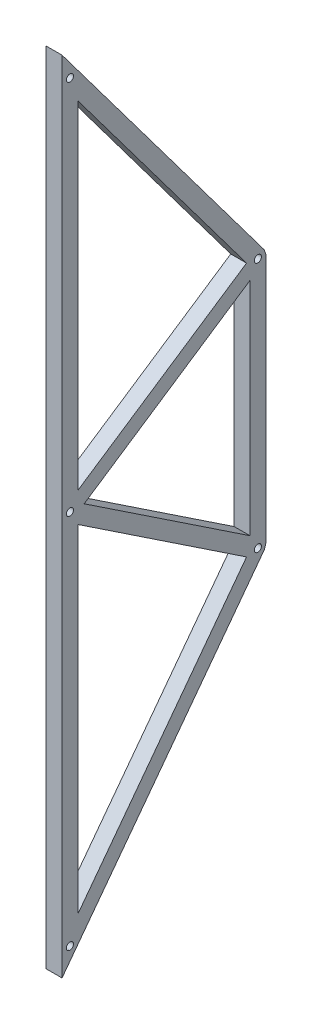
ISO-10303-21;
HEADER;
FILE_DESCRIPTION(('STEP AP214'),'2;1');
FILE_NAME('part.step','',(''),(''),'','','');
FILE_SCHEMA(('AUTOMOTIVE_DESIGN { 1 0 10303 214 1 1 1 1 }'));
ENDSEC;
DATA;
#1=APPLICATION_CONTEXT('core data for automotive mechanical design processes');
#2=APPLICATION_PROTOCOL_DEFINITION('international standard','automotive_design',2000,#1);
#3=PRODUCT_CONTEXT('',#1,'mechanical');
#4=PRODUCT('Part','Part','',(#3));
#5=PRODUCT_RELATED_PRODUCT_CATEGORY('part','',(#4));
#6=PRODUCT_DEFINITION_FORMATION('','',#4);
#7=PRODUCT_DEFINITION_CONTEXT('part definition',#1,'design');
#8=PRODUCT_DEFINITION('design','',#6,#7);
#9=PRODUCT_DEFINITION_SHAPE('','',#8);
#10=(LENGTH_UNIT() NAMED_UNIT(*) SI_UNIT(.MILLI.,.METRE.));
#11=(NAMED_UNIT(*) PLANE_ANGLE_UNIT() SI_UNIT($,.RADIAN.));
#12=(NAMED_UNIT(*) SI_UNIT($,.STERADIAN.) SOLID_ANGLE_UNIT());
#13=UNCERTAINTY_MEASURE_WITH_UNIT(LENGTH_MEASURE(1.E-05),#10,'distance_accuracy_value','');
#14=(GEOMETRIC_REPRESENTATION_CONTEXT(3) GLOBAL_UNCERTAINTY_ASSIGNED_CONTEXT((#13)) GLOBAL_UNIT_ASSIGNED_CONTEXT((#10,
#11,#12)) REPRESENTATION_CONTEXT('',''));
#15=CARTESIAN_POINT('',(0.,0.,0.));
#16=DIRECTION('',(0.,0.,1.));
#17=DIRECTION('',(1.,0.,0.));
#18=AXIS2_PLACEMENT_3D('',#15,#16,#17);
#19=CARTESIAN_POINT('',(25.23,0.,0.));
#20=DIRECTION('',(1.,0.,0.));
#21=DIRECTION('',(0.,0.,-1.));
#22=AXIS2_PLACEMENT_3D('',#19,#20,#21);
#23=PLANE('',#22);
#24=CARTESIAN_POINT('',(25.23,200.,-300.));
#25=DIRECTION('',(1.,0.,0.));
#26=DIRECTION('',(0.,0.,-1.));
#27=AXIS2_PLACEMENT_3D('',#24,#25,#26);
#28=CIRCLE('',#27,5.70999999999999);
#29=CARTESIAN_POINT('',(25.23,200.,-305.71));
#30=VERTEX_POINT('',#29);
#31=EDGE_CURVE('E181',#30,#30,#28,.T.);
#32=ORIENTED_EDGE('',*,*,#31,.F.);
#33=EDGE_LOOP('',(#32));
#34=FACE_BOUND('',#33,.T.);
#35=DIRECTION('',(0.,0.554700196225229,-0.832050294337844));
#36=VECTOR('',#35,1.);
#37=CARTESIAN_POINT('',(25.23,203.099228742217,-281.906828443337));
#38=LINE('',#37,#36);
#39=CARTESIAN_POINT('',(25.23,23.571343113326,-12.615));
#40=VERTEX_POINT('',#39);
#41=CARTESIAN_POINT('',(25.23,203.099228742217,-281.906828443337));
#42=VERTEX_POINT('',#41);
#43=EDGE_CURVE('E202',#40,#42,#38,.T.);
#44=ORIENTED_EDGE('',*,*,#43,.F.);
#45=DIRECTION('',(0.,-1.,0.));
#46=VECTOR('',#45,1.);
#47=CARTESIAN_POINT('',(25.23,562.155,-12.615));
#48=LINE('',#47,#46);
#49=CARTESIAN_POINT('',(25.23,562.155,-12.615));
#50=VERTEX_POINT('',#49);
#51=EDGE_CURVE('E199',#50,#40,#48,.T.);
#52=ORIENTED_EDGE('',*,*,#51,.F.);
#53=DIRECTION('',(0.,0.8,0.6));
#54=VECTOR('',#53,1.);
#55=CARTESIAN_POINT('',(25.23,203.099228742217,-281.906828443337));
#56=LINE('',#55,#54);
#57=EDGE_CURVE('E207',#42,#50,#56,.T.);
#58=ORIENTED_EDGE('',*,*,#57,.F.);
#59=EDGE_LOOP('',(#44,#52,#58));
#60=FACE_BOUND('',#59,.T.);
#61=CARTESIAN_POINT('',(25.23,0.,0.));
#62=DIRECTION('',(1.,0.,0.));
#63=DIRECTION('',(0.,0.,-1.));
#64=AXIS2_PLACEMENT_3D('',#61,#62,#63);
#65=CIRCLE('',#64,5.71);
#66=CARTESIAN_POINT('',(25.23,0.,-5.71));
#67=VERTEX_POINT('',#66);
#68=EDGE_CURVE('E232',#67,#67,#65,.T.);
#69=ORIENTED_EDGE('',*,*,#68,.F.);
#70=EDGE_LOOP('',(#69));
#71=FACE_BOUND('',#70,.T.);
#72=DIRECTION('',(0.,1.,0.));
#73=VECTOR('',#72,1.);
#74=CARTESIAN_POINT('',(25.23,-176.428656886674,-287.385));
#75=LINE('',#74,#73);
#76=CARTESIAN_POINT('',(25.23,-176.428656886674,-287.385));
#77=VERTEX_POINT('',#76);
#78=CARTESIAN_POINT('',(25.23,176.428656886674,-287.385));
#79=VERTEX_POINT('',#78);
#80=EDGE_CURVE('E251',#77,#79,#75,.T.);
#81=ORIENTED_EDGE('',*,*,#80,.F.);
#82=DIRECTION('',(0.,-0.554700196225229,-0.832050294337844));
#83=VECTOR('',#82,1.);
#84=CARTESIAN_POINT('',(25.23,-176.428656886674,-287.385));
#85=LINE('',#84,#83);
#86=CARTESIAN_POINT('',(25.23,0.,-22.7420146699891));
#87=VERTEX_POINT('',#86);
#88=EDGE_CURVE('E248',#87,#77,#85,.T.);
#89=ORIENTED_EDGE('',*,*,#88,.F.);
#90=DIRECTION('',(0.,-0.554700196225229,0.832050294337844));
#91=VECTOR('',#90,1.);
#92=CARTESIAN_POINT('',(25.23,176.428656886674,-287.385));
#93=LINE('',#92,#91);
#94=EDGE_CURVE('E256',#79,#87,#93,.T.);
#95=ORIENTED_EDGE('',*,*,#94,.F.);
#96=EDGE_LOOP('',(#81,#89,#95));
#97=FACE_BOUND('',#96,.T.);
#98=DIRECTION('',(0.,-1.,0.));
#99=VECTOR('',#98,1.);
#100=CARTESIAN_POINT('',(25.23,637.845,12.615));
#101=LINE('',#100,#99);
#102=CARTESIAN_POINT('',(25.23,637.845,12.615));
#103=VERTEX_POINT('',#102);
#104=CARTESIAN_POINT('',(25.23,-637.845,12.615));
#105=VERTEX_POINT('',#104);
#106=EDGE_CURVE('E281',#103,#105,#101,.T.);
#107=ORIENTED_EDGE('',*,*,#106,.T.);
#108=DIRECTION('',(0.,0.8,-0.6));
#109=VECTOR('',#108,1.);
#110=CARTESIAN_POINT('',(25.23,-637.845,12.615));
#111=LINE('',#110,#109);
#112=CARTESIAN_POINT('',(25.23,-207.569,-310.092));
#113=VERTEX_POINT('',#112);
#114=EDGE_CURVE('E284',#105,#113,#111,.T.);
#115=ORIENTED_EDGE('',*,*,#114,.T.);
#116=DIRECTION('',(0.,0.948683298050514,-0.316227766016837));
#117=VECTOR('',#116,1.);
#118=CARTESIAN_POINT('',(25.23,-200.,-312.615));
#119=LINE('',#118,#117);
#120=CARTESIAN_POINT('',(25.23,-200.,-312.615));
#121=VERTEX_POINT('',#120);
#122=EDGE_CURVE('E288',#113,#121,#119,.T.);
#123=ORIENTED_EDGE('',*,*,#122,.T.);
#124=DIRECTION('',(0.,1.,0.));
#125=VECTOR('',#124,1.);
#126=CARTESIAN_POINT('',(25.23,-200.,-312.615));
#127=LINE('',#126,#125);
#128=CARTESIAN_POINT('',(25.23,200.,-312.615));
#129=VERTEX_POINT('',#128);
#130=EDGE_CURVE('E291',#121,#129,#127,.T.);
#131=ORIENTED_EDGE('',*,*,#130,.T.);
#132=DIRECTION('',(0.,0.948683298050514,0.316227766016837));
#133=VECTOR('',#132,1.);
#134=CARTESIAN_POINT('',(25.23,207.569,-310.092));
#135=LINE('',#134,#133);
#136=CARTESIAN_POINT('',(25.23,207.569,-310.092));
#137=VERTEX_POINT('',#136);
#138=EDGE_CURVE('E294',#129,#137,#135,.T.);
#139=ORIENTED_EDGE('',*,*,#138,.T.);
#140=DIRECTION('',(0.,0.8,0.6));
#141=VECTOR('',#140,1.);
#142=CARTESIAN_POINT('',(25.23,207.569,-310.092));
#143=LINE('',#142,#141);
#144=EDGE_CURVE('E297',#137,#103,#143,.T.);
#145=ORIENTED_EDGE('',*,*,#144,.T.);
#146=EDGE_LOOP('',(#107,#115,#123,#131,#139,#145));
#147=FACE_BOUND('',#146,.T.);
#148=CARTESIAN_POINT('',(25.23,-600.,0.));
#149=DIRECTION('',(1.,0.,0.));
#150=DIRECTION('',(0.,0.,-1.));
#151=AXIS2_PLACEMENT_3D('',#148,#149,#150);
#152=CIRCLE('',#151,5.71000000000004);
#153=CARTESIAN_POINT('',(25.23,-600.,-5.71000000000004));
#154=VERTEX_POINT('',#153);
#155=EDGE_CURVE('E240',#154,#154,#152,.T.);
#156=ORIENTED_EDGE('',*,*,#155,.F.);
#157=EDGE_LOOP('',(#156));
#158=FACE_BOUND('',#157,.T.);
#159=CARTESIAN_POINT('',(25.23,-200.,-300.));
#160=DIRECTION('',(1.,0.,0.));
#161=DIRECTION('',(0.,0.,-1.));
#162=AXIS2_PLACEMENT_3D('',#159,#160,#161);
#163=CIRCLE('',#162,5.70999999999999);
#164=CARTESIAN_POINT('',(25.23,-200.,-305.71));
#165=VERTEX_POINT('',#164);
#166=EDGE_CURVE('E191',#165,#165,#163,.T.);
#167=ORIENTED_EDGE('',*,*,#166,.F.);
#168=EDGE_LOOP('',(#167));
#169=FACE_BOUND('',#168,.T.);
#170=DIRECTION('',(0.,0.8,-0.6));
#171=VECTOR('',#170,1.);
#172=CARTESIAN_POINT('',(25.23,-562.155,-12.615));
#173=LINE('',#172,#171);
#174=CARTESIAN_POINT('',(25.23,-562.155,-12.615));
#175=VERTEX_POINT('',#174);
#176=CARTESIAN_POINT('',(25.23,-203.099228742217,-281.906828443337));
#177=VERTEX_POINT('',#176);
#178=EDGE_CURVE('E161',#175,#177,#173,.T.);
#179=ORIENTED_EDGE('',*,*,#178,.F.);
#180=DIRECTION('',(0.,-1.,0.));
#181=VECTOR('',#180,1.);
#182=CARTESIAN_POINT('',(25.23,-23.571343113326,-12.615));
#183=LINE('',#182,#181);
#184=CARTESIAN_POINT('',(25.23,-23.571343113326,-12.615));
#185=VERTEX_POINT('',#184);
#186=EDGE_CURVE('E152',#185,#175,#183,.T.);
#187=ORIENTED_EDGE('',*,*,#186,.F.);
#188=DIRECTION('',(0.,0.554700196225229,0.832050294337844));
#189=VECTOR('',#188,1.);
#190=CARTESIAN_POINT('',(25.23,-203.099228742217,-281.906828443337));
#191=LINE('',#190,#189);
#192=EDGE_CURVE('E172',#177,#185,#191,.T.);
#193=ORIENTED_EDGE('',*,*,#192,.F.);
#194=EDGE_LOOP('',(#179,#187,#193));
#195=FACE_BOUND('',#194,.T.);
#196=CARTESIAN_POINT('',(25.23,600.,0.));
#197=DIRECTION('',(1.,0.,0.));
#198=DIRECTION('',(0.,0.,-1.));
#199=AXIS2_PLACEMENT_3D('',#196,#197,#198);
#200=CIRCLE('',#199,5.71000000000004);
#201=CARTESIAN_POINT('',(25.23,600.,-5.71000000000004));
#202=VERTEX_POINT('',#201);
#203=EDGE_CURVE('E439',#202,#202,#200,.T.);
#204=ORIENTED_EDGE('',*,*,#203,.F.);
#205=EDGE_LOOP('',(#204));
#206=FACE_BOUND('',#205,.T.);
#207=ADVANCED_FACE('F44',(#34,#60,#71,#97,#147,#158,#169,#195,#206),#23,.T.);
#208=CARTESIAN_POINT('',(0.,0.,0.));
#209=DIRECTION('',(1.,0.,0.));
#210=DIRECTION('',(0.,0.,-1.));
#211=AXIS2_PLACEMENT_3D('',#208,#209,#210);
#212=PLANE('',#211);
#213=CARTESIAN_POINT('',(0.,-200.,-300.));
#214=DIRECTION('',(1.,0.,0.));
#215=DIRECTION('',(0.,0.,-1.));
#216=AXIS2_PLACEMENT_3D('',#213,#214,#215);
#217=CIRCLE('',#216,5.70999999999999);
#218=CARTESIAN_POINT('',(0.,-200.,-305.71));
#219=VERTEX_POINT('',#218);
#220=EDGE_CURVE('E169',#219,#219,#217,.T.);
#221=ORIENTED_EDGE('',*,*,#220,.T.);
#222=EDGE_LOOP('',(#221));
#223=FACE_BOUND('',#222,.T.);
#224=DIRECTION('',(0.,-1.,0.));
#225=VECTOR('',#224,1.);
#226=CARTESIAN_POINT('',(0.,562.155,-12.615));
#227=LINE('',#226,#225);
#228=CARTESIAN_POINT('',(0.,562.155,-12.615));
#229=VERTEX_POINT('',#228);
#230=CARTESIAN_POINT('',(0.,23.571343113326,-12.615));
#231=VERTEX_POINT('',#230);
#232=EDGE_CURVE('E195',#229,#231,#227,.T.);
#233=ORIENTED_EDGE('',*,*,#232,.T.);
#234=DIRECTION('',(0.,0.554700196225229,-0.832050294337844));
#235=VECTOR('',#234,1.);
#236=CARTESIAN_POINT('',(0.,203.099228742217,-281.906828443337));
#237=LINE('',#236,#235);
#238=CARTESIAN_POINT('',(0.,203.099228742217,-281.906828443337));
#239=VERTEX_POINT('',#238);
#240=EDGE_CURVE('E214',#231,#239,#237,.T.);
#241=ORIENTED_EDGE('',*,*,#240,.T.);
#242=DIRECTION('',(0.,0.8,0.6));
#243=VECTOR('',#242,1.);
#244=CARTESIAN_POINT('',(0.,203.099228742217,-281.906828443337));
#245=LINE('',#244,#243);
#246=EDGE_CURVE('E203',#239,#229,#245,.T.);
#247=ORIENTED_EDGE('',*,*,#246,.T.);
#248=EDGE_LOOP('',(#233,#241,#247));
#249=FACE_BOUND('',#248,.T.);
#250=DIRECTION('',(0.,-1.,0.));
#251=VECTOR('',#250,1.);
#252=CARTESIAN_POINT('',(0.,0.,12.615));
#253=LINE('',#252,#251);
#254=CARTESIAN_POINT('',(0.,637.845,12.615));
#255=VERTEX_POINT('',#254);
#256=CARTESIAN_POINT('',(0.,-637.845,12.615));
#257=VERTEX_POINT('',#256);
#258=EDGE_CURVE('E280',#255,#257,#253,.T.);
#259=ORIENTED_EDGE('',*,*,#258,.F.);
#260=DIRECTION('',(0.,0.8,0.6));
#261=VECTOR('',#260,1.);
#262=CARTESIAN_POINT('',(0.,207.569,-310.092));
#263=LINE('',#262,#261);
#264=CARTESIAN_POINT('',(0.,207.569,-310.092));
#265=VERTEX_POINT('',#264);
#266=EDGE_CURVE('E285',#265,#255,#263,.T.);
#267=ORIENTED_EDGE('',*,*,#266,.F.);
#268=DIRECTION('',(0.,0.948683298050514,0.316227766016837));
#269=VECTOR('',#268,1.);
#270=CARTESIAN_POINT('',(0.,207.569,-310.092));
#271=LINE('',#270,#269);
#272=CARTESIAN_POINT('',(0.,200.,-312.615));
#273=VERTEX_POINT('',#272);
#274=EDGE_CURVE('E312',#273,#265,#271,.T.);
#275=ORIENTED_EDGE('',*,*,#274,.F.);
#276=DIRECTION('',(0.,1.,0.));
#277=VECTOR('',#276,1.);
#278=CARTESIAN_POINT('',(0.,-200.,-312.615));
#279=LINE('',#278,#277);
#280=CARTESIAN_POINT('',(0.,-200.,-312.615));
#281=VERTEX_POINT('',#280);
#282=EDGE_CURVE('E309',#281,#273,#279,.T.);
#283=ORIENTED_EDGE('',*,*,#282,.F.);
#284=DIRECTION('',(0.,0.948683298050514,-0.316227766016837));
#285=VECTOR('',#284,1.);
#286=CARTESIAN_POINT('',(0.,-200.,-312.615));
#287=LINE('',#286,#285);
#288=CARTESIAN_POINT('',(0.,-207.569,-310.092));
#289=VERTEX_POINT('',#288);
#290=EDGE_CURVE('E306',#289,#281,#287,.T.);
#291=ORIENTED_EDGE('',*,*,#290,.F.);
#292=DIRECTION('',(0.,0.8,-0.6));
#293=VECTOR('',#292,1.);
#294=CARTESIAN_POINT('',(0.,-637.845,12.615));
#295=LINE('',#294,#293);
#296=EDGE_CURVE('E303',#257,#289,#295,.T.);
#297=ORIENTED_EDGE('',*,*,#296,.F.);
#298=EDGE_LOOP('',(#259,#267,#275,#283,#291,#297));
#299=FACE_BOUND('',#298,.T.);
#300=DIRECTION('',(0.,-0.554700196225229,-0.832050294337844));
#301=VECTOR('',#300,1.);
#302=CARTESIAN_POINT('',(0.,-176.428656886674,-287.385));
#303=LINE('',#302,#301);
#304=CARTESIAN_POINT('',(0.,0.,-22.7420146699891));
#305=VERTEX_POINT('',#304);
#306=CARTESIAN_POINT('',(0.,-176.428656886674,-287.385));
#307=VERTEX_POINT('',#306);
#308=EDGE_CURVE('E244',#305,#307,#303,.T.);
#309=ORIENTED_EDGE('',*,*,#308,.T.);
#310=DIRECTION('',(0.,1.,0.));
#311=VECTOR('',#310,1.);
#312=CARTESIAN_POINT('',(0.,-176.428656886674,-287.385));
#313=LINE('',#312,#311);
#314=CARTESIAN_POINT('',(0.,176.428656886674,-287.385));
#315=VERTEX_POINT('',#314);
#316=EDGE_CURVE('E263',#307,#315,#313,.T.);
#317=ORIENTED_EDGE('',*,*,#316,.T.);
#318=DIRECTION('',(0.,-0.554700196225229,0.832050294337844));
#319=VECTOR('',#318,1.);
#320=CARTESIAN_POINT('',(0.,176.428656886674,-287.385));
#321=LINE('',#320,#319);
#322=EDGE_CURVE('E252',#315,#305,#321,.T.);
#323=ORIENTED_EDGE('',*,*,#322,.T.);
#324=EDGE_LOOP('',(#309,#317,#323));
#325=FACE_BOUND('',#324,.T.);
#326=CARTESIAN_POINT('',(0.,-600.,0.));
#327=DIRECTION('',(1.,0.,0.));
#328=DIRECTION('',(0.,0.,-1.));
#329=AXIS2_PLACEMENT_3D('',#326,#327,#328);
#330=CIRCLE('',#329,5.71000000000004);
#331=CARTESIAN_POINT('',(0.,-600.,-5.71000000000004));
#332=VERTEX_POINT('',#331);
#333=EDGE_CURVE('E236',#332,#332,#330,.T.);
#334=ORIENTED_EDGE('',*,*,#333,.T.);
#335=EDGE_LOOP('',(#334));
#336=FACE_BOUND('',#335,.T.);
#337=CARTESIAN_POINT('',(0.,0.,0.));
#338=DIRECTION('',(1.,0.,0.));
#339=DIRECTION('',(0.,0.,-1.));
#340=AXIS2_PLACEMENT_3D('',#337,#338,#339);
#341=CIRCLE('',#340,5.71);
#342=CARTESIAN_POINT('',(0.,0.,-5.71));
#343=VERTEX_POINT('',#342);
#344=EDGE_CURVE('E231',#343,#343,#341,.T.);
#345=ORIENTED_EDGE('',*,*,#344,.T.);
#346=EDGE_LOOP('',(#345));
#347=FACE_BOUND('',#346,.T.);
#348=DIRECTION('',(0.,-1.,0.));
#349=VECTOR('',#348,1.);
#350=CARTESIAN_POINT('',(0.,-23.571343113326,-12.615));
#351=LINE('',#350,#349);
#352=CARTESIAN_POINT('',(0.,-23.571343113326,-12.615));
#353=VERTEX_POINT('',#352);
#354=CARTESIAN_POINT('',(0.,-562.155,-12.615));
#355=VERTEX_POINT('',#354);
#356=EDGE_CURVE('E68',#353,#355,#351,.T.);
#357=ORIENTED_EDGE('',*,*,#356,.T.);
#358=DIRECTION('',(0.,0.8,-0.6));
#359=VECTOR('',#358,1.);
#360=CARTESIAN_POINT('',(0.,-562.155,-12.615));
#361=LINE('',#360,#359);
#362=CARTESIAN_POINT('',(0.,-203.099228742217,-281.906828443337));
#363=VERTEX_POINT('',#362);
#364=EDGE_CURVE('E167',#355,#363,#361,.T.);
#365=ORIENTED_EDGE('',*,*,#364,.T.);
#366=DIRECTION('',(0.,0.554700196225229,0.832050294337844));
#367=VECTOR('',#366,1.);
#368=CARTESIAN_POINT('',(0.,-203.099228742217,-281.906828443337));
#369=LINE('',#368,#367);
#370=EDGE_CURVE('E162',#363,#353,#369,.T.);
#371=ORIENTED_EDGE('',*,*,#370,.T.);
#372=EDGE_LOOP('',(#357,#365,#371));
#373=FACE_BOUND('',#372,.T.);
#374=CARTESIAN_POINT('',(0.,200.,-300.));
#375=DIRECTION('',(1.,0.,0.));
#376=DIRECTION('',(0.,0.,-1.));
#377=AXIS2_PLACEMENT_3D('',#374,#375,#376);
#378=CIRCLE('',#377,5.70999999999999);
#379=CARTESIAN_POINT('',(0.,200.,-305.71));
#380=VERTEX_POINT('',#379);
#381=EDGE_CURVE('E447',#380,#380,#378,.T.);
#382=ORIENTED_EDGE('',*,*,#381,.T.);
#383=EDGE_LOOP('',(#382));
#384=FACE_BOUND('',#383,.T.);
#385=CARTESIAN_POINT('',(0.,600.,0.));
#386=DIRECTION('',(1.,0.,0.));
#387=DIRECTION('',(0.,0.,-1.));
#388=AXIS2_PLACEMENT_3D('',#385,#386,#387);
#389=CIRCLE('',#388,5.71000000000004);
#390=CARTESIAN_POINT('',(0.,600.,-5.71000000000004));
#391=VERTEX_POINT('',#390);
#392=EDGE_CURVE('E442',#391,#391,#389,.T.);
#393=ORIENTED_EDGE('',*,*,#392,.T.);
#394=EDGE_LOOP('',(#393));
#395=FACE_BOUND('',#394,.T.);
#396=ADVANCED_FACE('F345',(#223,#249,#299,#325,#336,#347,#373,#384,#395),#212,.F.);
#397=CARTESIAN_POINT('',(25.23,0.,12.615));
#398=DIRECTION('',(0.,0.,-1.));
#399=DIRECTION('',(0.,1.,0.));
#400=AXIS2_PLACEMENT_3D('',#397,#398,#399);
#401=PLANE('',#400);
#402=ORIENTED_EDGE('',*,*,#258,.T.);
#403=DIRECTION('',(-1.,0.,0.));
#404=VECTOR('',#403,1.);
#405=CARTESIAN_POINT('',(25.23,-637.845,12.615));
#406=LINE('',#405,#404);
#407=EDGE_CURVE('E11',#105,#257,#406,.T.);
#408=ORIENTED_EDGE('',*,*,#407,.F.);
#409=ORIENTED_EDGE('',*,*,#106,.F.);
#410=DIRECTION('',(-1.,0.,0.));
#411=VECTOR('',#410,1.);
#412=CARTESIAN_POINT('',(25.23,637.845,12.615));
#413=LINE('',#412,#411);
#414=EDGE_CURVE('E300',#103,#255,#413,.T.);
#415=ORIENTED_EDGE('',*,*,#414,.T.);
#416=EDGE_LOOP('',(#402,#408,#409,#415));
#417=FACE_BOUND('',#416,.T.);
#418=ADVANCED_FACE('F46',(#417),#401,.F.);
#419=CARTESIAN_POINT('',(25.23,-637.845,12.615));
#420=DIRECTION('',(0.,0.6,0.8));
#421=DIRECTION('',(0.,-0.8,0.6));
#422=AXIS2_PLACEMENT_3D('',#419,#420,#421);
#423=PLANE('',#422);
#424=ORIENTED_EDGE('',*,*,#296,.T.);
#425=DIRECTION('',(-1.,0.,0.));
#426=VECTOR('',#425,1.);
#427=CARTESIAN_POINT('',(25.23,-207.569,-310.092));
#428=LINE('',#427,#426);
#429=EDGE_CURVE('E53',#113,#289,#428,.T.);
#430=ORIENTED_EDGE('',*,*,#429,.F.);
#431=ORIENTED_EDGE('',*,*,#114,.F.);
#432=ORIENTED_EDGE('',*,*,#407,.T.);
#433=EDGE_LOOP('',(#424,#430,#431,#432));
#434=FACE_BOUND('',#433,.T.);
#435=ADVANCED_FACE('F363',(#434),#423,.F.);
#436=CARTESIAN_POINT('',(25.23,-200.,-312.615));
#437=DIRECTION('',(0.,0.316227766016837,0.948683298050514));
#438=DIRECTION('',(0.,-0.948683298050514,0.316227766016837));
#439=AXIS2_PLACEMENT_3D('',#436,#437,#438);
#440=PLANE('',#439);
#441=ORIENTED_EDGE('',*,*,#290,.T.);
#442=DIRECTION('',(-1.,0.,0.));
#443=VECTOR('',#442,1.);
#444=CARTESIAN_POINT('',(25.23,-200.,-312.615));
#445=LINE('',#444,#443);
#446=EDGE_CURVE('E329',#121,#281,#445,.T.);
#447=ORIENTED_EDGE('',*,*,#446,.F.);
#448=ORIENTED_EDGE('',*,*,#122,.F.);
#449=ORIENTED_EDGE('',*,*,#429,.T.);
#450=EDGE_LOOP('',(#441,#447,#448,#449));
#451=FACE_BOUND('',#450,.T.);
#452=ADVANCED_FACE('F338',(#451),#440,.F.);
#453=CARTESIAN_POINT('',(25.23,-200.,-312.615));
#454=DIRECTION('',(0.,0.,1.));
#455=DIRECTION('',(1.,0.,0.));
#456=AXIS2_PLACEMENT_3D('',#453,#454,#455);
#457=PLANE('',#456);
#458=ORIENTED_EDGE('',*,*,#282,.T.);
#459=DIRECTION('',(-1.,0.,0.));
#460=VECTOR('',#459,1.);
#461=CARTESIAN_POINT('',(25.23,200.,-312.615));
#462=LINE('',#461,#460);
#463=EDGE_CURVE('E325',#129,#273,#462,.T.);
#464=ORIENTED_EDGE('',*,*,#463,.F.);
#465=ORIENTED_EDGE('',*,*,#130,.F.);
#466=ORIENTED_EDGE('',*,*,#446,.T.);
#467=EDGE_LOOP('',(#458,#464,#465,#466));
#468=FACE_BOUND('',#467,.T.);
#469=ADVANCED_FACE('F351',(#468),#457,.F.);
#470=CARTESIAN_POINT('',(25.23,207.569,-310.092));
#471=DIRECTION('',(0.,-0.316227766016837,0.948683298050514));
#472=DIRECTION('',(0.,-0.948683298050514,-0.316227766016837));
#473=AXIS2_PLACEMENT_3D('',#470,#471,#472);
#474=PLANE('',#473);
#475=ORIENTED_EDGE('',*,*,#274,.T.);
#476=DIRECTION('',(-1.,0.,0.));
#477=VECTOR('',#476,1.);
#478=CARTESIAN_POINT('',(25.23,207.569,-310.092));
#479=LINE('',#478,#477);
#480=EDGE_CURVE('E321',#137,#265,#479,.T.);
#481=ORIENTED_EDGE('',*,*,#480,.F.);
#482=ORIENTED_EDGE('',*,*,#138,.F.);
#483=ORIENTED_EDGE('',*,*,#463,.T.);
#484=EDGE_LOOP('',(#475,#481,#482,#483));
#485=FACE_BOUND('',#484,.T.);
#486=ADVANCED_FACE('F355',(#485),#474,.F.);
#487=CARTESIAN_POINT('',(25.23,207.569,-310.092));
#488=DIRECTION('',(0.,-0.6,0.8));
#489=DIRECTION('',(0.,-0.8,-0.6));
#490=AXIS2_PLACEMENT_3D('',#487,#488,#489);
#491=PLANE('',#490);
#492=ORIENTED_EDGE('',*,*,#266,.T.);
#493=ORIENTED_EDGE('',*,*,#414,.F.);
#494=ORIENTED_EDGE('',*,*,#144,.F.);
#495=ORIENTED_EDGE('',*,*,#480,.T.);
#496=EDGE_LOOP('',(#492,#493,#494,#495));
#497=FACE_BOUND('',#496,.T.);
#498=ADVANCED_FACE('F366',(#497),#491,.F.);
#499=CARTESIAN_POINT('',(25.23,-176.428656886674,-287.385));
#500=DIRECTION('',(0.,0.832050294337844,-0.554700196225229));
#501=DIRECTION('',(0.,0.554700196225229,0.832050294337844));
#502=AXIS2_PLACEMENT_3D('',#499,#500,#501);
#503=PLANE('',#502);
#504=ORIENTED_EDGE('',*,*,#308,.F.);
#505=DIRECTION('',(-1.,0.,0.));
#506=VECTOR('',#505,1.);
#507=CARTESIAN_POINT('',(25.23,0.,-22.7420146699891));
#508=LINE('',#507,#506);
#509=EDGE_CURVE('E259',#87,#305,#508,.T.);
#510=ORIENTED_EDGE('',*,*,#509,.F.);
#511=ORIENTED_EDGE('',*,*,#88,.T.);
#512=DIRECTION('',(-1.,0.,0.));
#513=VECTOR('',#512,1.);
#514=CARTESIAN_POINT('',(25.23,-176.428656886674,-287.385));
#515=LINE('',#514,#513);
#516=EDGE_CURVE('E276',#77,#307,#515,.T.);
#517=ORIENTED_EDGE('',*,*,#516,.T.);
#518=EDGE_LOOP('',(#504,#510,#511,#517));
#519=FACE_BOUND('',#518,.T.);
#520=ADVANCED_FACE('F368',(#519),#503,.T.);
#521=CARTESIAN_POINT('',(25.23,-176.428656886674,-287.385));
#522=DIRECTION('',(0.,0.,1.));
#523=DIRECTION('',(0.,-1.,0.));
#524=AXIS2_PLACEMENT_3D('',#521,#522,#523);
#525=PLANE('',#524);
#526=ORIENTED_EDGE('',*,*,#316,.F.);
#527=ORIENTED_EDGE('',*,*,#516,.F.);
#528=ORIENTED_EDGE('',*,*,#80,.T.);
#529=DIRECTION('',(-1.,0.,0.));
#530=VECTOR('',#529,1.);
#531=CARTESIAN_POINT('',(25.23,176.428656886674,-287.385));
#532=LINE('',#531,#530);
#533=EDGE_CURVE('E273',#79,#315,#532,.T.);
#534=ORIENTED_EDGE('',*,*,#533,.T.);
#535=EDGE_LOOP('',(#526,#527,#528,#534));
#536=FACE_BOUND('',#535,.T.);
#537=ADVANCED_FACE('F374',(#536),#525,.T.);
#538=CARTESIAN_POINT('',(25.23,176.428656886674,-287.385));
#539=DIRECTION('',(0.,-0.832050294337844,-0.554700196225229));
#540=DIRECTION('',(0.,0.554700196225229,-0.832050294337844));
#541=AXIS2_PLACEMENT_3D('',#538,#539,#540);
#542=PLANE('',#541);
#543=ORIENTED_EDGE('',*,*,#322,.F.);
#544=ORIENTED_EDGE('',*,*,#533,.F.);
#545=ORIENTED_EDGE('',*,*,#94,.T.);
#546=ORIENTED_EDGE('',*,*,#509,.T.);
#547=EDGE_LOOP('',(#543,#544,#545,#546));
#548=FACE_BOUND('',#547,.T.);
#549=ADVANCED_FACE('F391',(#548),#542,.T.);
#550=CARTESIAN_POINT('',(25.23,-600.,0.));
#551=DIRECTION('',(-1.,0.,0.));
#552=DIRECTION('',(0.,0.,1.));
#553=AXIS2_PLACEMENT_3D('',#550,#551,#552);
#554=CYLINDRICAL_SURFACE('',#553,5.71000000000004);
#555=ORIENTED_EDGE('',*,*,#155,.T.);
#556=EDGE_LOOP('',(#555));
#557=FACE_BOUND('',#556,.T.);
#558=ORIENTED_EDGE('',*,*,#333,.F.);
#559=EDGE_LOOP('',(#558));
#560=FACE_BOUND('',#559,.T.);
#561=ADVANCED_FACE('F395',(#557,#560),#554,.F.);
#562=CARTESIAN_POINT('',(25.23,0.,0.));
#563=DIRECTION('',(-1.,0.,0.));
#564=DIRECTION('',(0.,0.,1.));
#565=AXIS2_PLACEMENT_3D('',#562,#563,#564);
#566=CYLINDRICAL_SURFACE('',#565,5.71);
#567=ORIENTED_EDGE('',*,*,#68,.T.);
#568=EDGE_LOOP('',(#567));
#569=FACE_BOUND('',#568,.T.);
#570=ORIENTED_EDGE('',*,*,#344,.F.);
#571=EDGE_LOOP('',(#570));
#572=FACE_BOUND('',#571,.T.);
#573=ADVANCED_FACE('F399',(#569,#572),#566,.F.);
#574=CARTESIAN_POINT('',(25.23,562.155,-12.615));
#575=DIRECTION('',(0.,0.,-1.));
#576=DIRECTION('',(0.,1.,0.));
#577=AXIS2_PLACEMENT_3D('',#574,#575,#576);
#578=PLANE('',#577);
#579=ORIENTED_EDGE('',*,*,#232,.F.);
#580=DIRECTION('',(-1.,0.,0.));
#581=VECTOR('',#580,1.);
#582=CARTESIAN_POINT('',(25.23,562.155,-12.615));
#583=LINE('',#582,#581);
#584=EDGE_CURVE('E210',#50,#229,#583,.T.);
#585=ORIENTED_EDGE('',*,*,#584,.F.);
#586=ORIENTED_EDGE('',*,*,#51,.T.);
#587=DIRECTION('',(-1.,0.,0.));
#588=VECTOR('',#587,1.);
#589=CARTESIAN_POINT('',(25.23,23.571343113326,-12.615));
#590=LINE('',#589,#588);
#591=EDGE_CURVE('E227',#40,#231,#590,.T.);
#592=ORIENTED_EDGE('',*,*,#591,.T.);
#593=EDGE_LOOP('',(#579,#585,#586,#592));
#594=FACE_BOUND('',#593,.T.);
#595=ADVANCED_FACE('F403',(#594),#578,.T.);
#596=CARTESIAN_POINT('',(25.23,203.099228742217,-281.906828443337));
#597=DIRECTION('',(0.,0.832050294337844,0.554700196225229));
#598=DIRECTION('',(0.,-0.554700196225229,0.832050294337844));
#599=AXIS2_PLACEMENT_3D('',#596,#597,#598);
#600=PLANE('',#599);
#601=ORIENTED_EDGE('',*,*,#240,.F.);
#602=ORIENTED_EDGE('',*,*,#591,.F.);
#603=ORIENTED_EDGE('',*,*,#43,.T.);
#604=DIRECTION('',(-1.,0.,0.));
#605=VECTOR('',#604,1.);
#606=CARTESIAN_POINT('',(25.23,203.099228742217,-281.906828443337));
#607=LINE('',#606,#605);
#608=EDGE_CURVE('E224',#42,#239,#607,.T.);
#609=ORIENTED_EDGE('',*,*,#608,.T.);
#610=EDGE_LOOP('',(#601,#602,#603,#609));
#611=FACE_BOUND('',#610,.T.);
#612=ADVANCED_FACE('F407',(#611),#600,.T.);
#613=CARTESIAN_POINT('',(25.23,203.099228742217,-281.906828443337));
#614=DIRECTION('',(0.,-0.6,0.8));
#615=DIRECTION('',(0.,-0.8,-0.6));
#616=AXIS2_PLACEMENT_3D('',#613,#614,#615);
#617=PLANE('',#616);
#618=ORIENTED_EDGE('',*,*,#246,.F.);
#619=ORIENTED_EDGE('',*,*,#608,.F.);
#620=ORIENTED_EDGE('',*,*,#57,.T.);
#621=ORIENTED_EDGE('',*,*,#584,.T.);
#622=EDGE_LOOP('',(#618,#619,#620,#621));
#623=FACE_BOUND('',#622,.T.);
#624=ADVANCED_FACE('F411',(#623),#617,.T.);
#625=CARTESIAN_POINT('',(25.23,-200.,-300.));
#626=DIRECTION('',(-1.,0.,0.));
#627=DIRECTION('',(0.,0.,1.));
#628=AXIS2_PLACEMENT_3D('',#625,#626,#627);
#629=CYLINDRICAL_SURFACE('',#628,5.70999999999999);
#630=ORIENTED_EDGE('',*,*,#166,.T.);
#631=EDGE_LOOP('',(#630));
#632=FACE_BOUND('',#631,.T.);
#633=ORIENTED_EDGE('',*,*,#220,.F.);
#634=EDGE_LOOP('',(#633));
#635=FACE_BOUND('',#634,.T.);
#636=ADVANCED_FACE('F415',(#632,#635),#629,.F.);
#637=CARTESIAN_POINT('',(25.23,-23.571343113326,-12.615));
#638=DIRECTION('',(0.,0.,-1.));
#639=DIRECTION('',(0.,1.,0.));
#640=AXIS2_PLACEMENT_3D('',#637,#638,#639);
#641=PLANE('',#640);
#642=ORIENTED_EDGE('',*,*,#356,.F.);
#643=DIRECTION('',(-1.,0.,0.));
#644=VECTOR('',#643,1.);
#645=CARTESIAN_POINT('',(25.23,-23.571343113326,-12.615));
#646=LINE('',#645,#644);
#647=EDGE_CURVE('E156',#185,#353,#646,.T.);
#648=ORIENTED_EDGE('',*,*,#647,.F.);
#649=ORIENTED_EDGE('',*,*,#186,.T.);
#650=DIRECTION('',(-1.,0.,0.));
#651=VECTOR('',#650,1.);
#652=CARTESIAN_POINT('',(25.23,-562.155,-12.615));
#653=LINE('',#652,#651);
#654=EDGE_CURVE('E155',#175,#355,#653,.T.);
#655=ORIENTED_EDGE('',*,*,#654,.T.);
#656=EDGE_LOOP('',(#642,#648,#649,#655));
#657=FACE_BOUND('',#656,.T.);
#658=ADVANCED_FACE('F154',(#657),#641,.T.);
#659=CARTESIAN_POINT('',(25.23,-562.155,-12.615));
#660=DIRECTION('',(0.,0.6,0.8));
#661=DIRECTION('',(0.,-0.8,0.6));
#662=AXIS2_PLACEMENT_3D('',#659,#660,#661);
#663=PLANE('',#662);
#664=ORIENTED_EDGE('',*,*,#364,.F.);
#665=ORIENTED_EDGE('',*,*,#654,.F.);
#666=ORIENTED_EDGE('',*,*,#178,.T.);
#667=DIRECTION('',(-1.,0.,0.));
#668=VECTOR('',#667,1.);
#669=CARTESIAN_POINT('',(25.23,-203.099228742217,-281.906828443337));
#670=LINE('',#669,#668);
#671=EDGE_CURVE('E60',#177,#363,#670,.T.);
#672=ORIENTED_EDGE('',*,*,#671,.T.);
#673=EDGE_LOOP('',(#664,#665,#666,#672));
#674=FACE_BOUND('',#673,.T.);
#675=ADVANCED_FACE('F165',(#674),#663,.T.);
#676=CARTESIAN_POINT('',(25.23,-203.099228742217,-281.906828443337));
#677=DIRECTION('',(0.,-0.832050294337843,0.554700196225229));
#678=DIRECTION('',(0.,-0.554700196225229,-0.832050294337843));
#679=AXIS2_PLACEMENT_3D('',#676,#677,#678);
#680=PLANE('',#679);
#681=ORIENTED_EDGE('',*,*,#370,.F.);
#682=ORIENTED_EDGE('',*,*,#671,.F.);
#683=ORIENTED_EDGE('',*,*,#192,.T.);
#684=ORIENTED_EDGE('',*,*,#647,.T.);
#685=EDGE_LOOP('',(#681,#682,#683,#684));
#686=FACE_BOUND('',#685,.T.);
#687=ADVANCED_FACE('F424',(#686),#680,.T.);
#688=CARTESIAN_POINT('',(25.23,200.,-300.));
#689=DIRECTION('',(-1.,0.,0.));
#690=DIRECTION('',(0.,0.,1.));
#691=AXIS2_PLACEMENT_3D('',#688,#689,#690);
#692=CYLINDRICAL_SURFACE('',#691,5.70999999999999);
#693=ORIENTED_EDGE('',*,*,#31,.T.);
#694=EDGE_LOOP('',(#693));
#695=FACE_BOUND('',#694,.T.);
#696=ORIENTED_EDGE('',*,*,#381,.F.);
#697=EDGE_LOOP('',(#696));
#698=FACE_BOUND('',#697,.T.);
#699=ADVANCED_FACE('F427',(#695,#698),#692,.F.);
#700=CARTESIAN_POINT('',(25.23,600.,0.));
#701=DIRECTION('',(-1.,0.,0.));
#702=DIRECTION('',(0.,0.,1.));
#703=AXIS2_PLACEMENT_3D('',#700,#701,#702);
#704=CYLINDRICAL_SURFACE('',#703,5.71000000000004);
#705=ORIENTED_EDGE('',*,*,#203,.T.);
#706=EDGE_LOOP('',(#705));
#707=FACE_BOUND('',#706,.T.);
#708=ORIENTED_EDGE('',*,*,#392,.F.);
#709=EDGE_LOOP('',(#708));
#710=FACE_BOUND('',#709,.T.);
#711=ADVANCED_FACE('F430',(#707,#710),#704,.F.);
#712=CLOSED_SHELL('',(#207,#396,#418,#435,#452,#469,#486,#498,#520,#537,#549,#561,#573,#595,
#612,#624,#636,#658,#675,#687,#699,#711));
#713=MANIFOLD_SOLID_BREP('B2',#712);
#714=ADVANCED_BREP_SHAPE_REPRESENTATION('',(#18,#713),#14);
#715=SHAPE_DEFINITION_REPRESENTATION(#9,#714);
ENDSEC;
END-ISO-10303-21;
